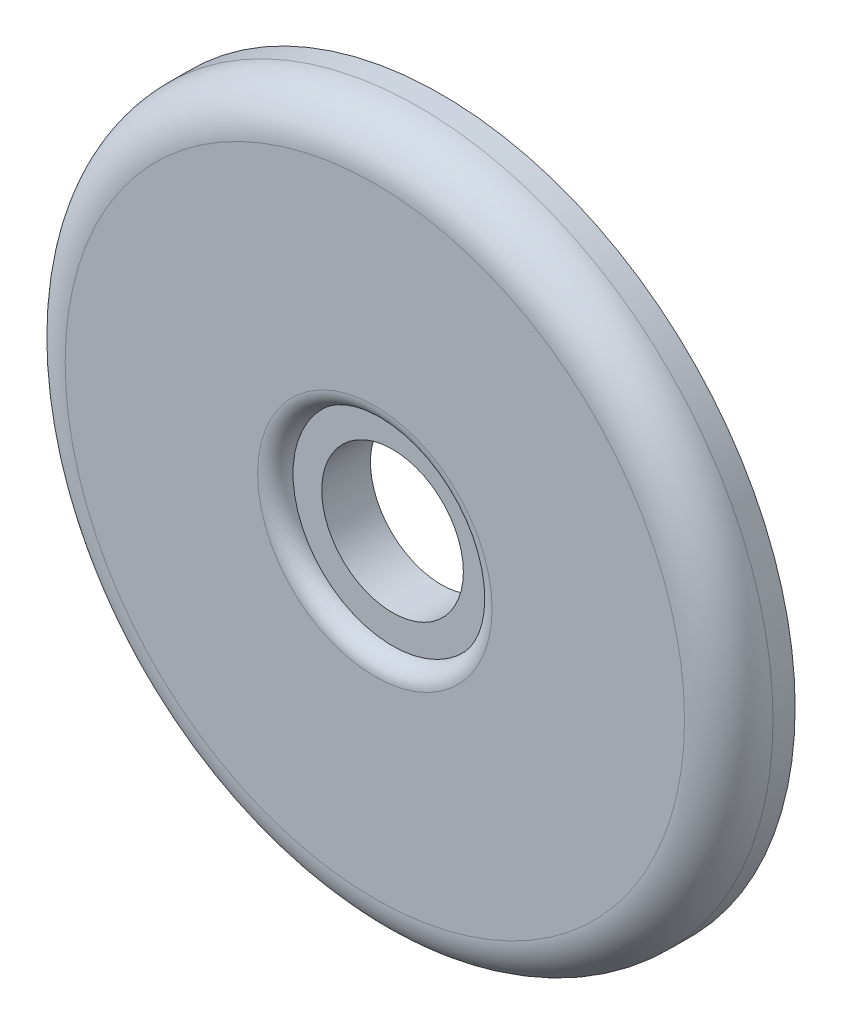
ISO-10303-21;
HEADER;
FILE_DESCRIPTION(('STEP AP214'),'2;1');
FILE_NAME('part.step','',(''),(''),'','','');
FILE_SCHEMA(('AUTOMOTIVE_DESIGN { 1 0 10303 214 1 1 1 1 }'));
ENDSEC;
DATA;
#1=APPLICATION_CONTEXT('core data for automotive mechanical design processes');
#2=APPLICATION_PROTOCOL_DEFINITION('international standard','automotive_design',2000,#1);
#3=PRODUCT_CONTEXT('',#1,'mechanical');
#4=PRODUCT('Part','Part','',(#3));
#5=PRODUCT_RELATED_PRODUCT_CATEGORY('part','',(#4));
#6=PRODUCT_DEFINITION_FORMATION('','',#4);
#7=PRODUCT_DEFINITION_CONTEXT('part definition',#1,'design');
#8=PRODUCT_DEFINITION('design','',#6,#7);
#9=PRODUCT_DEFINITION_SHAPE('','',#8);
#10=(LENGTH_UNIT() NAMED_UNIT(*) SI_UNIT(.MILLI.,.METRE.));
#11=(NAMED_UNIT(*) PLANE_ANGLE_UNIT() SI_UNIT($,.RADIAN.));
#12=(NAMED_UNIT(*) SI_UNIT($,.STERADIAN.) SOLID_ANGLE_UNIT());
#13=UNCERTAINTY_MEASURE_WITH_UNIT(LENGTH_MEASURE(1.E-05),#10,'distance_accuracy_value','');
#14=(GEOMETRIC_REPRESENTATION_CONTEXT(3) GLOBAL_UNCERTAINTY_ASSIGNED_CONTEXT((#13)) GLOBAL_UNIT_ASSIGNED_CONTEXT((#10,
#11,#12)) REPRESENTATION_CONTEXT('',''));
#15=CARTESIAN_POINT('',(0.,0.,0.));
#16=DIRECTION('',(0.,0.,1.));
#17=DIRECTION('',(1.,0.,0.));
#18=AXIS2_PLACEMENT_3D('',#15,#16,#17);
#19=CARTESIAN_POINT('',(0.,0.,1.5));
#20=DIRECTION('',(0.,0.,-1.));
#21=DIRECTION('',(-1.,0.,0.));
#22=AXIS2_PLACEMENT_3D('',#19,#20,#21);
#23=CYLINDRICAL_SURFACE('',#22,1.6);
#24=CARTESIAN_POINT('',(0.,0.,0.));
#25=DIRECTION('',(0.,0.,1.));
#26=DIRECTION('',(1.,0.,0.));
#27=AXIS2_PLACEMENT_3D('',#24,#25,#26);
#28=CIRCLE('',#27,1.6);
#29=CARTESIAN_POINT('',(1.6,0.,0.));
#30=VERTEX_POINT('',#29);
#31=EDGE_CURVE('E56',#30,#30,#28,.T.);
#32=ORIENTED_EDGE('',*,*,#31,.F.);
#33=EDGE_LOOP('',(#32));
#34=FACE_BOUND('',#33,.T.);
#35=CARTESIAN_POINT('',(0.,0.,1.1));
#36=DIRECTION('',(0.,0.,1.));
#37=DIRECTION('',(1.,0.,0.));
#38=AXIS2_PLACEMENT_3D('',#35,#36,#37);
#39=CIRCLE('',#38,1.6);
#40=CARTESIAN_POINT('',(1.6,0.,1.1));
#41=VERTEX_POINT('',#40);
#42=EDGE_CURVE('E54',#41,#41,#39,.T.);
#43=ORIENTED_EDGE('',*,*,#42,.T.);
#44=EDGE_LOOP('',(#43));
#45=FACE_BOUND('',#44,.T.);
#46=ADVANCED_FACE('F35',(#34,#45),#23,.F.);
#47=CARTESIAN_POINT('',(0.,0.,1.5));
#48=DIRECTION('',(0.,0.,1.));
#49=DIRECTION('',(1.,0.,0.));
#50=AXIS2_PLACEMENT_3D('',#47,#48,#49);
#51=PLANE('',#50);
#52=CARTESIAN_POINT('',(0.,0.,1.5));
#53=DIRECTION('',(0.,0.,1.));
#54=DIRECTION('',(1.,0.,0.));
#55=AXIS2_PLACEMENT_3D('',#52,#53,#54);
#56=CIRCLE('',#55,2.65);
#57=CARTESIAN_POINT('',(2.65,0.,1.5));
#58=VERTEX_POINT('',#57);
#59=EDGE_CURVE('E10',#58,#58,#56,.F.);
#60=ORIENTED_EDGE('',*,*,#59,.T.);
#61=EDGE_LOOP('',(#60));
#62=FACE_BOUND('',#61,.T.);
#63=CARTESIAN_POINT('',(0.,0.,1.5));
#64=DIRECTION('',(0.,0.,1.));
#65=DIRECTION('',(1.,0.,0.));
#66=AXIS2_PLACEMENT_3D('',#63,#64,#65);
#67=CIRCLE('',#66,7.);
#68=CARTESIAN_POINT('',(7.,0.,1.5));
#69=VERTEX_POINT('',#68);
#70=EDGE_CURVE('E46',#69,#69,#67,.T.);
#71=ORIENTED_EDGE('',*,*,#70,.T.);
#72=EDGE_LOOP('',(#71));
#73=FACE_BOUND('',#72,.T.);
#74=ADVANCED_FACE('F74',(#62,#73),#51,.T.);
#75=CARTESIAN_POINT('',(0.,0.,0.));
#76=DIRECTION('',(0.,0.,1.));
#77=DIRECTION('',(1.,0.,0.));
#78=AXIS2_PLACEMENT_3D('',#75,#76,#77);
#79=PLANE('',#78);
#80=CARTESIAN_POINT('',(0.,0.,0.));
#81=DIRECTION('',(0.,0.,1.));
#82=DIRECTION('',(1.,0.,0.));
#83=AXIS2_PLACEMENT_3D('',#80,#81,#82);
#84=CIRCLE('',#83,8.);
#85=CARTESIAN_POINT('',(8.,0.,0.));
#86=VERTEX_POINT('',#85);
#87=EDGE_CURVE('E51',#86,#86,#84,.T.);
#88=ORIENTED_EDGE('',*,*,#87,.F.);
#89=EDGE_LOOP('',(#88));
#90=FACE_BOUND('',#89,.T.);
#91=ORIENTED_EDGE('',*,*,#31,.T.);
#92=EDGE_LOOP('',(#91));
#93=FACE_BOUND('',#92,.T.);
#94=ADVANCED_FACE('F71',(#90,#93),#79,.F.);
#95=CARTESIAN_POINT('',(0.,0.,1.5));
#96=DIRECTION('',(0.,0.,-1.));
#97=DIRECTION('',(-1.,0.,0.));
#98=AXIS2_PLACEMENT_3D('',#95,#96,#97);
#99=CYLINDRICAL_SURFACE('',#98,8.);
#100=CARTESIAN_POINT('',(0.,0.,0.5));
#101=DIRECTION('',(0.,0.,1.));
#102=DIRECTION('',(1.,0.,0.));
#103=AXIS2_PLACEMENT_3D('',#100,#101,#102);
#104=CIRCLE('',#103,8.);
#105=CARTESIAN_POINT('',(8.,0.,0.5));
#106=VERTEX_POINT('',#105);
#107=EDGE_CURVE('E42',#106,#106,#104,.F.);
#108=ORIENTED_EDGE('',*,*,#107,.T.);
#109=EDGE_LOOP('',(#108));
#110=FACE_BOUND('',#109,.T.);
#111=ORIENTED_EDGE('',*,*,#87,.T.);
#112=EDGE_LOOP('',(#111));
#113=FACE_BOUND('',#112,.T.);
#114=ADVANCED_FACE('F69',(#110,#113),#99,.T.);
#115=CARTESIAN_POINT('',(0.,0.,0.5));
#116=DIRECTION('',(0.,0.,1.));
#117=DIRECTION('',(1.,0.,0.));
#118=AXIS2_PLACEMENT_3D('',#115,#116,#117);
#119=TOROIDAL_SURFACE('',#118,7.,1.);
#120=ORIENTED_EDGE('',*,*,#107,.F.);
#121=EDGE_LOOP('',(#120));
#122=FACE_BOUND('',#121,.T.);
#123=ORIENTED_EDGE('',*,*,#70,.F.);
#124=EDGE_LOOP('',(#123));
#125=FACE_BOUND('',#124,.T.);
#126=ADVANCED_FACE('F88',(#122,#125),#119,.T.);
#127=CARTESIAN_POINT('',(0.,0.,1.1));
#128=DIRECTION('',(0.,0.,1.));
#129=DIRECTION('',(1.,0.,0.));
#130=AXIS2_PLACEMENT_3D('',#127,#128,#129);
#131=PLANE('',#130);
#132=ORIENTED_EDGE('',*,*,#42,.F.);
#133=EDGE_LOOP('',(#132));
#134=FACE_BOUND('',#133,.T.);
#135=CARTESIAN_POINT('',(0.,0.,1.1));
#136=DIRECTION('',(0.,0.,1.));
#137=DIRECTION('',(1.,0.,0.));
#138=AXIS2_PLACEMENT_3D('',#135,#136,#137);
#139=CIRCLE('',#138,2.25);
#140=CARTESIAN_POINT('',(2.25,0.,1.1));
#141=VERTEX_POINT('',#140);
#142=EDGE_CURVE('E57',#141,#141,#139,.T.);
#143=ORIENTED_EDGE('',*,*,#142,.T.);
#144=EDGE_LOOP('',(#143));
#145=FACE_BOUND('',#144,.T.);
#146=ADVANCED_FACE('F85',(#134,#145),#131,.T.);
#147=CARTESIAN_POINT('',(0.,0.,1.1));
#148=DIRECTION('',(0.,0.,1.));
#149=DIRECTION('',(1.,0.,0.));
#150=AXIS2_PLACEMENT_3D('',#147,#148,#149);
#151=TOROIDAL_SURFACE('',#150,2.65,0.4);
#152=ORIENTED_EDGE('',*,*,#59,.F.);
#153=EDGE_LOOP('',(#152));
#154=FACE_BOUND('',#153,.T.);
#155=ORIENTED_EDGE('',*,*,#142,.F.);
#156=EDGE_LOOP('',(#155));
#157=FACE_BOUND('',#156,.T.);
#158=ADVANCED_FACE('F37',(#154,#157),#151,.T.);
#159=CLOSED_SHELL('',(#46,#74,#94,#114,#126,#146,#158));
#160=MANIFOLD_SOLID_BREP('B2',#159);
#161=ADVANCED_BREP_SHAPE_REPRESENTATION('',(#18,#160),#14);
#162=SHAPE_DEFINITION_REPRESENTATION(#9,#161);
ENDSEC;
END-ISO-10303-21;
